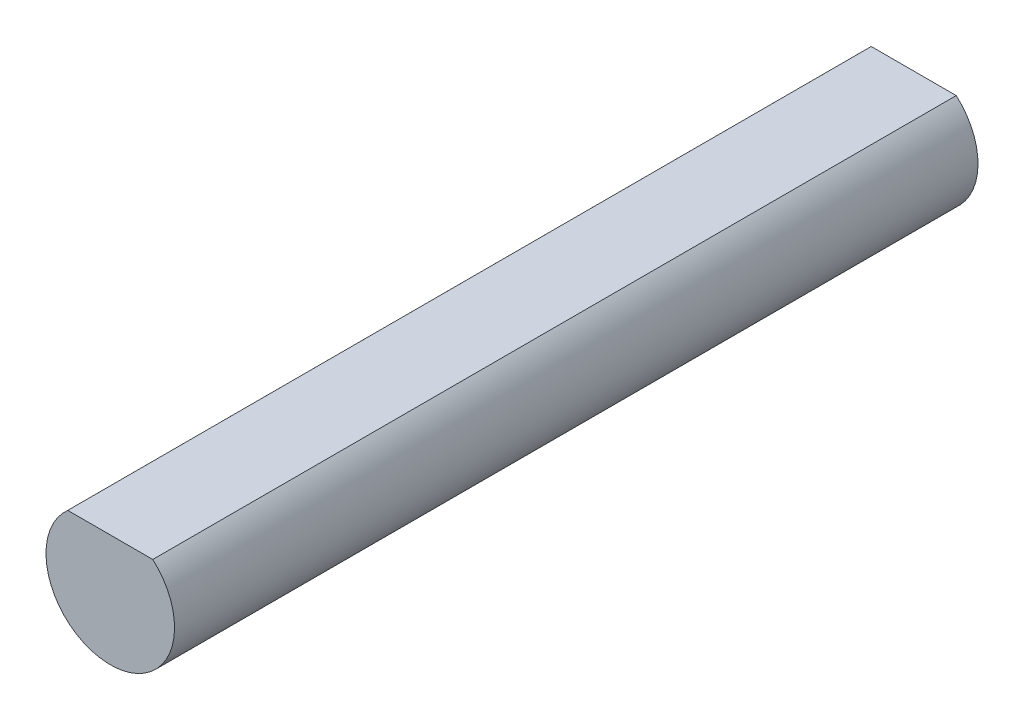
ISO-10303-21;
HEADER;
FILE_DESCRIPTION(('STEP AP214'),'2;1');
FILE_NAME('part.step','',(''),(''),'','','');
FILE_SCHEMA(('AUTOMOTIVE_DESIGN { 1 0 10303 214 1 1 1 1 }'));
ENDSEC;
DATA;
#1=APPLICATION_CONTEXT('core data for automotive mechanical design processes');
#2=APPLICATION_PROTOCOL_DEFINITION('international standard','automotive_design',2000,#1);
#3=PRODUCT_CONTEXT('',#1,'mechanical');
#4=PRODUCT('Part','Part','',(#3));
#5=PRODUCT_RELATED_PRODUCT_CATEGORY('part','',(#4));
#6=PRODUCT_DEFINITION_FORMATION('','',#4);
#7=PRODUCT_DEFINITION_CONTEXT('part definition',#1,'design');
#8=PRODUCT_DEFINITION('design','',#6,#7);
#9=PRODUCT_DEFINITION_SHAPE('','',#8);
#10=(LENGTH_UNIT() NAMED_UNIT(*) SI_UNIT(.MILLI.,.METRE.));
#11=(NAMED_UNIT(*) PLANE_ANGLE_UNIT() SI_UNIT($,.RADIAN.));
#12=(NAMED_UNIT(*) SI_UNIT($,.STERADIAN.) SOLID_ANGLE_UNIT());
#13=UNCERTAINTY_MEASURE_WITH_UNIT(LENGTH_MEASURE(1.E-05),#10,'distance_accuracy_value','');
#14=(GEOMETRIC_REPRESENTATION_CONTEXT(3) GLOBAL_UNCERTAINTY_ASSIGNED_CONTEXT((#13)) GLOBAL_UNIT_ASSIGNED_CONTEXT((#10,
#11,#12)) REPRESENTATION_CONTEXT('',''));
#15=CARTESIAN_POINT('',(0.,0.,0.));
#16=DIRECTION('',(0.,0.,1.));
#17=DIRECTION('',(1.,0.,0.));
#18=AXIS2_PLACEMENT_3D('',#15,#16,#17);
#19=CARTESIAN_POINT('',(0.,0.,25.));
#20=DIRECTION('',(0.,0.,-1.));
#21=DIRECTION('',(-1.,0.,0.));
#22=AXIS2_PLACEMENT_3D('',#19,#20,#21);
#23=CYLINDRICAL_SURFACE('',#22,2.);
#24=CARTESIAN_POINT('',(0.,0.,0.));
#25=DIRECTION('',(0.,0.,1.));
#26=DIRECTION('',(1.,0.,0.));
#27=AXIS2_PLACEMENT_3D('',#24,#25,#26);
#28=CIRCLE('',#27,2.);
#29=CARTESIAN_POINT('',(-1.32287565553229,1.5,0.));
#30=VERTEX_POINT('',#29);
#31=CARTESIAN_POINT('',(1.32287565553229,1.5,0.));
#32=VERTEX_POINT('',#31);
#33=EDGE_CURVE('E64',#30,#32,#28,.T.);
#34=ORIENTED_EDGE('',*,*,#33,.T.);
#35=DIRECTION('',(0.,0.,-1.));
#36=VECTOR('',#35,1.);
#37=CARTESIAN_POINT('',(1.32287565553229,1.5,25.));
#38=LINE('',#37,#36);
#39=CARTESIAN_POINT('',(1.32287565553229,1.5,25.));
#40=VERTEX_POINT('',#39);
#41=EDGE_CURVE('E11',#40,#32,#38,.T.);
#42=ORIENTED_EDGE('',*,*,#41,.F.);
#43=CARTESIAN_POINT('',(0.,0.,25.));
#44=DIRECTION('',(0.,0.,1.));
#45=DIRECTION('',(1.,0.,0.));
#46=AXIS2_PLACEMENT_3D('',#43,#44,#45);
#47=CIRCLE('',#46,2.);
#48=CARTESIAN_POINT('',(-1.32287565553229,1.5,25.));
#49=VERTEX_POINT('',#48);
#50=EDGE_CURVE('E63',#49,#40,#47,.T.);
#51=ORIENTED_EDGE('',*,*,#50,.F.);
#52=DIRECTION('',(0.,0.,-1.));
#53=VECTOR('',#52,1.);
#54=CARTESIAN_POINT('',(-1.32287565553229,1.5,25.));
#55=LINE('',#54,#53);
#56=EDGE_CURVE('E41',#49,#30,#55,.T.);
#57=ORIENTED_EDGE('',*,*,#56,.T.);
#58=EDGE_LOOP('',(#34,#42,#51,#57));
#59=FACE_BOUND('',#58,.T.);
#60=ADVANCED_FACE('F33',(#59),#23,.T.);
#61=CARTESIAN_POINT('',(1.32287565553229,1.5,25.));
#62=DIRECTION('',(0.,-1.,0.));
#63=DIRECTION('',(1.,0.,0.));
#64=AXIS2_PLACEMENT_3D('',#61,#62,#63);
#65=PLANE('',#64);
#66=DIRECTION('',(-1.,0.,0.));
#67=VECTOR('',#66,1.);
#68=CARTESIAN_POINT('',(1.32287565553229,1.5,0.));
#69=LINE('',#68,#67);
#70=EDGE_CURVE('E56',#32,#30,#69,.T.);
#71=ORIENTED_EDGE('',*,*,#70,.T.);
#72=ORIENTED_EDGE('',*,*,#56,.F.);
#73=DIRECTION('',(-1.,0.,0.));
#74=VECTOR('',#73,1.);
#75=CARTESIAN_POINT('',(1.32287565553229,1.5,25.));
#76=LINE('',#75,#74);
#77=EDGE_CURVE('E48',#40,#49,#76,.T.);
#78=ORIENTED_EDGE('',*,*,#77,.F.);
#79=ORIENTED_EDGE('',*,*,#41,.T.);
#80=EDGE_LOOP('',(#71,#72,#78,#79));
#81=FACE_BOUND('',#80,.T.);
#82=ADVANCED_FACE('F59',(#81),#65,.F.);
#83=CARTESIAN_POINT('',(0.,0.,25.));
#84=DIRECTION('',(0.,0.,1.));
#85=DIRECTION('',(1.,0.,0.));
#86=AXIS2_PLACEMENT_3D('',#83,#84,#85);
#87=PLANE('',#86);
#88=ORIENTED_EDGE('',*,*,#50,.T.);
#89=ORIENTED_EDGE('',*,*,#77,.T.);
#90=EDGE_LOOP('',(#88,#89));
#91=FACE_BOUND('',#90,.T.);
#92=ADVANCED_FACE('F71',(#91),#87,.T.);
#93=CARTESIAN_POINT('',(0.,0.,0.));
#94=DIRECTION('',(0.,0.,1.));
#95=DIRECTION('',(1.,0.,0.));
#96=AXIS2_PLACEMENT_3D('',#93,#94,#95);
#97=PLANE('',#96);
#98=ORIENTED_EDGE('',*,*,#33,.F.);
#99=ORIENTED_EDGE('',*,*,#70,.F.);
#100=EDGE_LOOP('',(#98,#99));
#101=FACE_BOUND('',#100,.T.);
#102=ADVANCED_FACE('F67',(#101),#97,.F.);
#103=CLOSED_SHELL('',(#60,#82,#92,#102));
#104=MANIFOLD_SOLID_BREP('B2',#103);
#105=ADVANCED_BREP_SHAPE_REPRESENTATION('',(#18,#104),#14);
#106=SHAPE_DEFINITION_REPRESENTATION(#9,#105);
ENDSEC;
END-ISO-10303-21;
